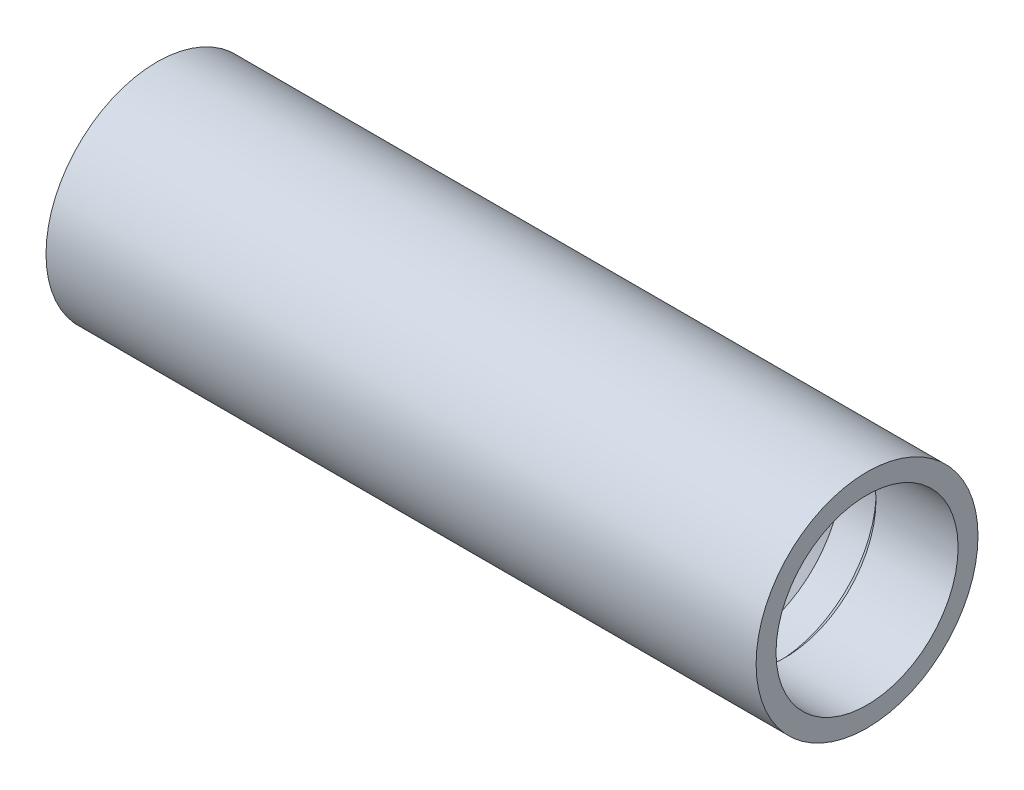
ISO-10303-21;
HEADER;
FILE_DESCRIPTION(('STEP AP214'),'2;1');
FILE_NAME('part.step','',(''),(''),'','','');
FILE_SCHEMA(('AUTOMOTIVE_DESIGN { 1 0 10303 214 1 1 1 1 }'));
ENDSEC;
DATA;
#1=APPLICATION_CONTEXT('core data for automotive mechanical design processes');
#2=APPLICATION_PROTOCOL_DEFINITION('international standard','automotive_design',2000,#1);
#3=PRODUCT_CONTEXT('',#1,'mechanical');
#4=PRODUCT('Part','Part','',(#3));
#5=PRODUCT_RELATED_PRODUCT_CATEGORY('part','',(#4));
#6=PRODUCT_DEFINITION_FORMATION('','',#4);
#7=PRODUCT_DEFINITION_CONTEXT('part definition',#1,'design');
#8=PRODUCT_DEFINITION('design','',#6,#7);
#9=PRODUCT_DEFINITION_SHAPE('','',#8);
#10=(LENGTH_UNIT() NAMED_UNIT(*) SI_UNIT(.MILLI.,.METRE.));
#11=(NAMED_UNIT(*) PLANE_ANGLE_UNIT() SI_UNIT($,.RADIAN.));
#12=(NAMED_UNIT(*) SI_UNIT($,.STERADIAN.) SOLID_ANGLE_UNIT());
#13=UNCERTAINTY_MEASURE_WITH_UNIT(LENGTH_MEASURE(1.E-05),#10,'distance_accuracy_value','');
#14=(GEOMETRIC_REPRESENTATION_CONTEXT(3) GLOBAL_UNCERTAINTY_ASSIGNED_CONTEXT((#13)) GLOBAL_UNIT_ASSIGNED_CONTEXT((#10,
#11,#12)) REPRESENTATION_CONTEXT('',''));
#15=CARTESIAN_POINT('',(0.,0.,0.));
#16=DIRECTION('',(0.,0.,1.));
#17=DIRECTION('',(1.,0.,0.));
#18=AXIS2_PLACEMENT_3D('',#15,#16,#17);
#19=CARTESIAN_POINT('',(35.56,0.,0.));
#20=DIRECTION('',(-1.,0.,0.));
#21=DIRECTION('',(0.,0.,1.));
#22=AXIS2_PLACEMENT_3D('',#19,#20,#21);
#23=CYLINDRICAL_SURFACE('',#22,4.5593);
#24=CARTESIAN_POINT('',(4.25270145520313,0.,0.));
#25=DIRECTION('',(1.,0.,0.));
#26=DIRECTION('',(0.,0.,-1.));
#27=AXIS2_PLACEMENT_3D('',#24,#25,#26);
#28=CIRCLE('',#27,4.5593);
#29=CARTESIAN_POINT('',(4.25270145520313,0.,-4.5593));
#30=VERTEX_POINT('',#29);
#31=EDGE_CURVE('E40',#30,#30,#28,.F.);
#32=ORIENTED_EDGE('',*,*,#31,.F.);
#33=EDGE_LOOP('',(#32));
#34=FACE_BOUND('',#33,.T.);
#35=CARTESIAN_POINT('',(0.,0.,0.));
#36=DIRECTION('',(1.,0.,0.));
#37=DIRECTION('',(0.,0.,-1.));
#38=AXIS2_PLACEMENT_3D('',#35,#36,#37);
#39=CIRCLE('',#38,4.5593);
#40=CARTESIAN_POINT('',(0.,0.,-4.5593));
#41=VERTEX_POINT('',#40);
#42=EDGE_CURVE('E54',#41,#41,#39,.T.);
#43=ORIENTED_EDGE('',*,*,#42,.F.);
#44=EDGE_LOOP('',(#43));
#45=FACE_BOUND('',#44,.T.);
#46=ADVANCED_FACE('F36',(#34,#45),#23,.F.);
#47=CARTESIAN_POINT('',(35.56,0.,0.));
#48=DIRECTION('',(1.,0.,0.));
#49=DIRECTION('',(0.,0.,-1.));
#50=AXIS2_PLACEMENT_3D('',#47,#48,#49);
#51=PLANE('',#50);
#52=CARTESIAN_POINT('',(35.56,0.,0.));
#53=DIRECTION('',(1.,0.,0.));
#54=DIRECTION('',(0.,0.,-1.));
#55=AXIS2_PLACEMENT_3D('',#52,#53,#54);
#56=CIRCLE('',#55,5.55625);
#57=CARTESIAN_POINT('',(35.56,0.,-5.55625));
#58=VERTEX_POINT('',#57);
#59=EDGE_CURVE('E10',#58,#58,#56,.T.);
#60=ORIENTED_EDGE('',*,*,#59,.T.);
#61=EDGE_LOOP('',(#60));
#62=FACE_BOUND('',#61,.T.);
#63=CARTESIAN_POINT('',(35.56,0.,0.));
#64=DIRECTION('',(1.,0.,0.));
#65=DIRECTION('',(0.,0.,-1.));
#66=AXIS2_PLACEMENT_3D('',#63,#64,#65);
#67=CIRCLE('',#66,4.5593);
#68=CARTESIAN_POINT('',(35.56,0.,-4.5593));
#69=VERTEX_POINT('',#68);
#70=EDGE_CURVE('E51',#69,#69,#67,.T.);
#71=ORIENTED_EDGE('',*,*,#70,.F.);
#72=EDGE_LOOP('',(#71));
#73=FACE_BOUND('',#72,.T.);
#74=ADVANCED_FACE('F137',(#62,#73),#51,.T.);
#75=CARTESIAN_POINT('',(0.,0.,0.));
#76=DIRECTION('',(1.,0.,0.));
#77=DIRECTION('',(0.,0.,-1.));
#78=AXIS2_PLACEMENT_3D('',#75,#76,#77);
#79=PLANE('',#78);
#80=CARTESIAN_POINT('',(0.,0.,0.));
#81=DIRECTION('',(1.,0.,0.));
#82=DIRECTION('',(0.,0.,-1.));
#83=AXIS2_PLACEMENT_3D('',#80,#81,#82);
#84=CIRCLE('',#83,5.55625);
#85=CARTESIAN_POINT('',(0.,0.,-5.55625));
#86=VERTEX_POINT('',#85);
#87=EDGE_CURVE('E45',#86,#86,#84,.T.);
#88=ORIENTED_EDGE('',*,*,#87,.F.);
#89=EDGE_LOOP('',(#88));
#90=FACE_BOUND('',#89,.T.);
#91=ORIENTED_EDGE('',*,*,#42,.T.);
#92=EDGE_LOOP('',(#91));
#93=FACE_BOUND('',#92,.T.);
#94=ADVANCED_FACE('F143',(#90,#93),#79,.F.);
#95=CARTESIAN_POINT('',(35.56,0.,0.));
#96=DIRECTION('',(-1.,0.,0.));
#97=DIRECTION('',(0.,0.,1.));
#98=AXIS2_PLACEMENT_3D('',#95,#96,#97);
#99=CYLINDRICAL_SURFACE('',#98,5.55625);
#100=ORIENTED_EDGE('',*,*,#59,.F.);
#101=EDGE_LOOP('',(#100));
#102=FACE_BOUND('',#101,.T.);
#103=ORIENTED_EDGE('',*,*,#87,.T.);
#104=EDGE_LOOP('',(#103));
#105=FACE_BOUND('',#104,.T.);
#106=ADVANCED_FACE('F38',(#102,#105),#99,.T.);
#107=CARTESIAN_POINT('',(31.4491900537303,0.,0.));
#108=DIRECTION('',(-1.,0.,0.));
#109=DIRECTION('',(0.,0.,1.));
#110=AXIS2_PLACEMENT_3D('',#107,#108,#109);
#111=CIRCLE('',#110,4.5593);
#112=CARTESIAN_POINT('',(31.4491900537303,0.,4.5593));
#113=VERTEX_POINT('',#112);
#114=EDGE_CURVE('E66',#113,#113,#111,.F.);
#115=ORIENTED_EDGE('',*,*,#114,.F.);
#116=EDGE_LOOP('',(#115));
#117=FACE_BOUND('',#116,.T.);
#118=ORIENTED_EDGE('',*,*,#70,.T.);
#119=EDGE_LOOP('',(#118));
#120=FACE_BOUND('',#119,.T.);
#121=ADVANCED_FACE('F125',(#117,#120),#23,.F.);
#122=CARTESIAN_POINT('',(28.7744656820891,0.,0.));
#123=DIRECTION('',(1.,0.,0.));
#124=DIRECTION('',(0.,0.,-1.));
#125=AXIS2_PLACEMENT_3D('',#122,#123,#124);
#126=CONICAL_SURFACE('',#125,4.445,0.804747703124117);
#127=CARTESIAN_POINT('',(28.8844258101949,0.,0.));
#128=DIRECTION('',(1.,0.,0.));
#129=DIRECTION('',(0.,0.,-1.));
#130=AXIS2_PLACEMENT_3D('',#127,#128,#129);
#131=CIRCLE('',#130,4.5593);
#132=CARTESIAN_POINT('',(28.8844258101949,0.,-4.5593));
#133=VERTEX_POINT('',#132);
#134=EDGE_CURVE('E70',#133,#133,#131,.F.);
#135=ORIENTED_EDGE('',*,*,#134,.T.);
#136=EDGE_LOOP('',(#135));
#137=FACE_BOUND('',#136,.T.);
#138=CARTESIAN_POINT('',(29.3131381017773,0.,0.));
#139=DIRECTION('',(-1.,0.,0.));
#140=DIRECTION('',(0.,0.,1.));
#141=AXIS2_PLACEMENT_3D('',#138,#139,#140);
#142=CIRCLE('',#141,5.00493257402468);
#143=CARTESIAN_POINT('',(29.3131381017773,0.,5.00493257402468));
#144=VERTEX_POINT('',#143);
#145=EDGE_CURVE('E98',#144,#144,#142,.T.);
#146=ORIENTED_EDGE('',*,*,#145,.F.);
#147=EDGE_LOOP('',(#146));
#148=FACE_BOUND('',#147,.T.);
#149=ADVANCED_FACE('F120',(#137,#148),#126,.F.);
#150=CARTESIAN_POINT('',(0.,0.,0.));
#151=DIRECTION('',(-1.,0.,0.));
#152=DIRECTION('',(0.,0.,1.));
#153=AXIS2_PLACEMENT_3D('',#150,#151,#152);
#154=CYLINDRICAL_SURFACE('',#153,5.00493257402468);
#155=CARTESIAN_POINT('',(31.0204777621479,0.,0.));
#156=DIRECTION('',(-1.,0.,0.));
#157=DIRECTION('',(0.,0.,1.));
#158=AXIS2_PLACEMENT_3D('',#155,#156,#157);
#159=CIRCLE('',#158,5.00493257402468);
#160=CARTESIAN_POINT('',(31.0204777621479,0.,5.00493257402468));
#161=VERTEX_POINT('',#160);
#162=EDGE_CURVE('E103',#161,#161,#159,.T.);
#163=ORIENTED_EDGE('',*,*,#162,.F.);
#164=EDGE_LOOP('',(#163));
#165=FACE_BOUND('',#164,.T.);
#166=ORIENTED_EDGE('',*,*,#145,.T.);
#167=EDGE_LOOP('',(#166));
#168=FACE_BOUND('',#167,.T.);
#169=ADVANCED_FACE('F117',(#165,#168),#154,.F.);
#170=CARTESIAN_POINT('',(31.0204777621479,0.,0.));
#171=DIRECTION('',(-1.,0.,0.));
#172=DIRECTION('',(0.,0.,1.));
#173=AXIS2_PLACEMENT_3D('',#170,#171,#172);
#174=CONICAL_SURFACE('',#173,5.00493257402468,0.804747703124117);
#175=ORIENTED_EDGE('',*,*,#114,.T.);
#176=EDGE_LOOP('',(#175));
#177=FACE_BOUND('',#176,.T.);
#178=ORIENTED_EDGE('',*,*,#162,.T.);
#179=EDGE_LOOP('',(#178));
#180=FACE_BOUND('',#179,.T.);
#181=ADVANCED_FACE('F115',(#177,#180),#174,.F.);
#182=CARTESIAN_POINT('',(4.18268878561534,0.,0.));
#183=DIRECTION('',(1.,0.,0.));
#184=DIRECTION('',(0.,0.,-1.));
#185=AXIS2_PLACEMENT_3D('',#182,#183,#184);
#186=CONICAL_SURFACE('',#185,4.445,1.02121137676922);
#187=ORIENTED_EDGE('',*,*,#31,.T.);
#188=EDGE_LOOP('',(#187));
#189=FACE_BOUND('',#188,.T.);
#190=CARTESIAN_POINT('',(4.63302935711815,0.,0.));
#191=DIRECTION('',(-1.,0.,0.));
#192=DIRECTION('',(0.,0.,1.));
#193=AXIS2_PLACEMENT_3D('',#190,#191,#192);
#194=CIRCLE('',#193,5.18020875044235);
#195=CARTESIAN_POINT('',(4.63302935711815,0.,5.18020875044235));
#196=VERTEX_POINT('',#195);
#197=EDGE_CURVE('E99',#196,#196,#194,.T.);
#198=ORIENTED_EDGE('',*,*,#197,.F.);
#199=EDGE_LOOP('',(#198));
#200=FACE_BOUND('',#199,.T.);
#201=ADVANCED_FACE('F183',(#189,#200),#186,.F.);
#202=CARTESIAN_POINT('',(0.,0.,0.));
#203=DIRECTION('',(-1.,0.,0.));
#204=DIRECTION('',(0.,0.,1.));
#205=AXIS2_PLACEMENT_3D('',#202,#203,#204);
#206=CYLINDRICAL_SURFACE('',#205,5.18020875044235);
#207=CARTESIAN_POINT('',(7.10673738675937,0.,0.));
#208=DIRECTION('',(-1.,0.,0.));
#209=DIRECTION('',(0.,0.,1.));
#210=AXIS2_PLACEMENT_3D('',#207,#208,#209);
#211=CIRCLE('',#210,5.18020875044235);
#212=CARTESIAN_POINT('',(7.10673738675937,0.,5.18020875044235));
#213=VERTEX_POINT('',#212);
#214=EDGE_CURVE('E104',#213,#213,#211,.T.);
#215=ORIENTED_EDGE('',*,*,#214,.F.);
#216=EDGE_LOOP('',(#215));
#217=FACE_BOUND('',#216,.T.);
#218=ORIENTED_EDGE('',*,*,#197,.T.);
#219=EDGE_LOOP('',(#218));
#220=FACE_BOUND('',#219,.T.);
#221=ADVANCED_FACE('F159',(#217,#220),#206,.F.);
#222=CARTESIAN_POINT('',(7.10673738675937,0.,0.));
#223=DIRECTION('',(-1.,0.,0.));
#224=DIRECTION('',(0.,0.,1.));
#225=AXIS2_PLACEMENT_3D('',#222,#223,#224);
#226=CONICAL_SURFACE('',#225,5.18020875044235,1.02121137676922);
#227=CARTESIAN_POINT('',(7.48706528867439,0.,0.));
#228=DIRECTION('',(-1.,0.,0.));
#229=DIRECTION('',(0.,0.,1.));
#230=AXIS2_PLACEMENT_3D('',#227,#228,#229);
#231=CIRCLE('',#230,4.5593);
#232=CARTESIAN_POINT('',(7.48706528867439,0.,4.5593));
#233=VERTEX_POINT('',#232);
#234=EDGE_CURVE('E73',#233,#233,#231,.F.);
#235=ORIENTED_EDGE('',*,*,#234,.T.);
#236=EDGE_LOOP('',(#235));
#237=FACE_BOUND('',#236,.T.);
#238=ORIENTED_EDGE('',*,*,#214,.T.);
#239=EDGE_LOOP('',(#238));
#240=FACE_BOUND('',#239,.T.);
#241=ADVANCED_FACE('F149',(#237,#240),#226,.F.);
#242=ORIENTED_EDGE('',*,*,#134,.F.);
#243=EDGE_LOOP('',(#242));
#244=FACE_BOUND('',#243,.T.);
#245=CARTESIAN_POINT('',(19.9365983650763,0.,0.));
#246=DIRECTION('',(-1.,0.,0.));
#247=DIRECTION('',(0.,0.,1.));
#248=AXIS2_PLACEMENT_3D('',#245,#246,#247);
#249=CIRCLE('',#248,4.5593);
#250=CARTESIAN_POINT('',(19.9365983650763,0.,4.5593));
#251=VERTEX_POINT('',#250);
#252=EDGE_CURVE('E57',#251,#251,#249,.F.);
#253=ORIENTED_EDGE('',*,*,#252,.F.);
#254=EDGE_LOOP('',(#253));
#255=FACE_BOUND('',#254,.T.);
#256=ADVANCED_FACE('F139',(#244,#255),#23,.F.);
#257=CARTESIAN_POINT('',(17.5702327910239,0.,0.));
#258=DIRECTION('',(1.,0.,0.));
#259=DIRECTION('',(0.,0.,-1.));
#260=AXIS2_PLACEMENT_3D('',#257,#258,#259);
#261=CONICAL_SURFACE('',#260,4.445,0.867415400707804);
#262=CARTESIAN_POINT('',(17.6671688415084,0.,0.));
#263=DIRECTION('',(1.,0.,0.));
#264=DIRECTION('',(0.,0.,-1.));
#265=AXIS2_PLACEMENT_3D('',#262,#263,#264);
#266=CIRCLE('',#265,4.5593);
#267=CARTESIAN_POINT('',(17.6671688415084,0.,-4.5593));
#268=VERTEX_POINT('',#267);
#269=EDGE_CURVE('E61',#268,#268,#266,.F.);
#270=ORIENTED_EDGE('',*,*,#269,.T.);
#271=EDGE_LOOP('',(#270));
#272=FACE_BOUND('',#271,.T.);
#273=CARTESIAN_POINT('',(18.0205733625267,0.,0.));
#274=DIRECTION('',(-1.,0.,0.));
#275=DIRECTION('',(0.,0.,1.));
#276=AXIS2_PLACEMENT_3D('',#273,#274,#275);
#277=CIRCLE('',#276,4.97600912473217);
#278=CARTESIAN_POINT('',(18.0205733625267,0.,4.97600912473217));
#279=VERTEX_POINT('',#278);
#280=EDGE_CURVE('E62',#279,#279,#277,.T.);
#281=ORIENTED_EDGE('',*,*,#280,.F.);
#282=EDGE_LOOP('',(#281));
#283=FACE_BOUND('',#282,.T.);
#284=ADVANCED_FACE('F148',(#272,#283),#261,.F.);
#285=CARTESIAN_POINT('',(0.,0.,0.));
#286=DIRECTION('',(-1.,0.,0.));
#287=DIRECTION('',(0.,0.,1.));
#288=AXIS2_PLACEMENT_3D('',#285,#286,#287);
#289=CYLINDRICAL_SURFACE('',#288,4.97600912473217);
#290=CARTESIAN_POINT('',(19.583193844058,0.,0.));
#291=DIRECTION('',(-1.,0.,0.));
#292=DIRECTION('',(0.,0.,1.));
#293=AXIS2_PLACEMENT_3D('',#290,#291,#292);
#294=CIRCLE('',#293,4.97600912473217);
#295=CARTESIAN_POINT('',(19.583193844058,0.,4.97600912473217));
#296=VERTEX_POINT('',#295);
#297=EDGE_CURVE('E94',#296,#296,#294,.T.);
#298=ORIENTED_EDGE('',*,*,#297,.F.);
#299=EDGE_LOOP('',(#298));
#300=FACE_BOUND('',#299,.T.);
#301=ORIENTED_EDGE('',*,*,#280,.T.);
#302=EDGE_LOOP('',(#301));
#303=FACE_BOUND('',#302,.T.);
#304=ADVANCED_FACE('F156',(#300,#303),#289,.F.);
#305=CARTESIAN_POINT('',(19.583193844058,0.,0.));
#306=DIRECTION('',(-1.,0.,0.));
#307=DIRECTION('',(0.,0.,1.));
#308=AXIS2_PLACEMENT_3D('',#305,#306,#307);
#309=CONICAL_SURFACE('',#308,4.97600912473217,0.867415400707804);
#310=ORIENTED_EDGE('',*,*,#252,.T.);
#311=EDGE_LOOP('',(#310));
#312=FACE_BOUND('',#311,.T.);
#313=ORIENTED_EDGE('',*,*,#297,.T.);
#314=EDGE_LOOP('',(#313));
#315=FACE_BOUND('',#314,.T.);
#316=ADVANCED_FACE('F163',(#312,#315),#309,.F.);
#317=ORIENTED_EDGE('',*,*,#234,.F.);
#318=EDGE_LOOP('',(#317));
#319=FACE_BOUND('',#318,.T.);
#320=ORIENTED_EDGE('',*,*,#269,.F.);
#321=EDGE_LOOP('',(#320));
#322=FACE_BOUND('',#321,.T.);
#323=ADVANCED_FACE('F134',(#319,#322),#23,.F.);
#324=CLOSED_SHELL('',(#46,#74,#94,#106,#121,#149,#169,#181,#201,#221,#241,#256,#284,#304,#316,#323));
#325=MANIFOLD_SOLID_BREP('B2',#324);
#326=ADVANCED_BREP_SHAPE_REPRESENTATION('',(#18,#325),#14);
#327=SHAPE_DEFINITION_REPRESENTATION(#9,#326);
ENDSEC;
END-ISO-10303-21;
